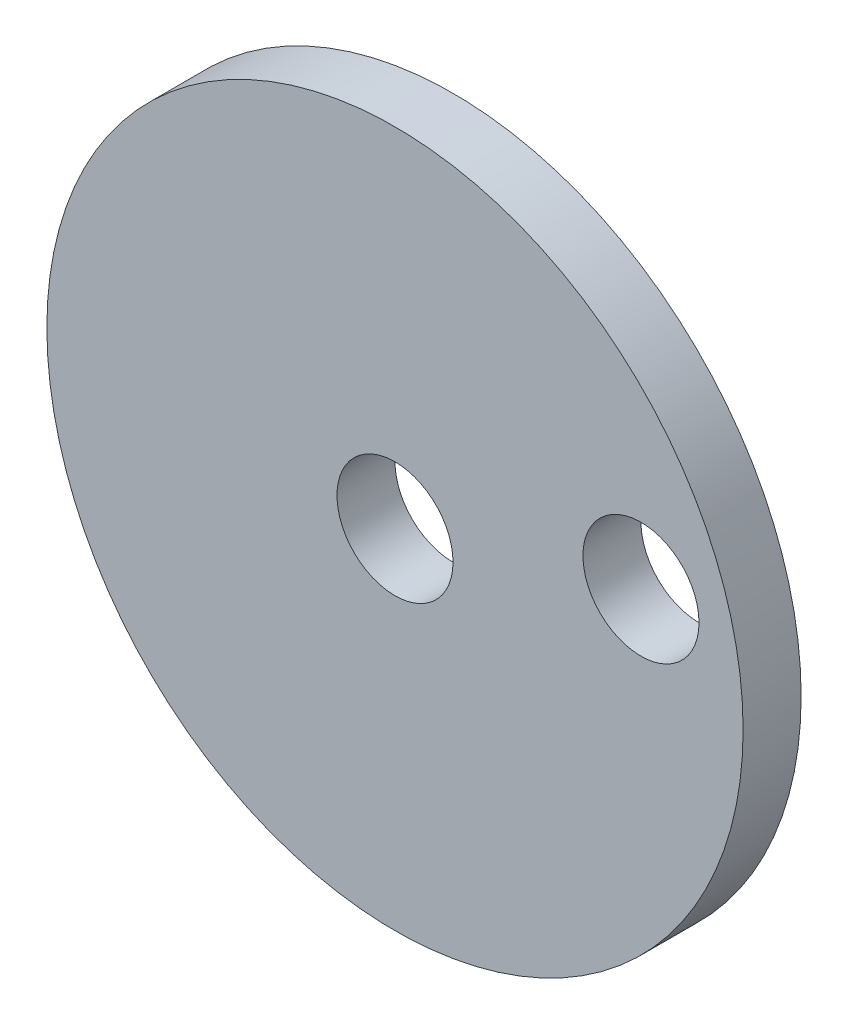
ISO-10303-21;
HEADER;
FILE_DESCRIPTION(('STEP AP214'),'2;1');
FILE_NAME('part.step','',(''),(''),'','','');
FILE_SCHEMA(('AUTOMOTIVE_DESIGN { 1 0 10303 214 1 1 1 1 }'));
ENDSEC;
DATA;
#1=APPLICATION_CONTEXT('core data for automotive mechanical design processes');
#2=APPLICATION_PROTOCOL_DEFINITION('international standard','automotive_design',2000,#1);
#3=PRODUCT_CONTEXT('',#1,'mechanical');
#4=PRODUCT('Part','Part','',(#3));
#5=PRODUCT_RELATED_PRODUCT_CATEGORY('part','',(#4));
#6=PRODUCT_DEFINITION_FORMATION('','',#4);
#7=PRODUCT_DEFINITION_CONTEXT('part definition',#1,'design');
#8=PRODUCT_DEFINITION('design','',#6,#7);
#9=PRODUCT_DEFINITION_SHAPE('','',#8);
#10=(LENGTH_UNIT() NAMED_UNIT(*) SI_UNIT(.MILLI.,.METRE.));
#11=(NAMED_UNIT(*) PLANE_ANGLE_UNIT() SI_UNIT($,.RADIAN.));
#12=(NAMED_UNIT(*) SI_UNIT($,.STERADIAN.) SOLID_ANGLE_UNIT());
#13=UNCERTAINTY_MEASURE_WITH_UNIT(LENGTH_MEASURE(1.E-05),#10,'distance_accuracy_value','');
#14=(GEOMETRIC_REPRESENTATION_CONTEXT(3) GLOBAL_UNCERTAINTY_ASSIGNED_CONTEXT((#13)) GLOBAL_UNIT_ASSIGNED_CONTEXT((#10,
#11,#12)) REPRESENTATION_CONTEXT('',''));
#15=CARTESIAN_POINT('',(0.,0.,0.));
#16=DIRECTION('',(0.,0.,1.));
#17=DIRECTION('',(1.,0.,0.));
#18=AXIS2_PLACEMENT_3D('',#15,#16,#17);
#19=CARTESIAN_POINT('',(0.,0.,6.35));
#20=DIRECTION('',(0.,0.,1.));
#21=DIRECTION('',(1.,0.,0.));
#22=AXIS2_PLACEMENT_3D('',#19,#20,#21);
#23=PLANE('',#22);
#24=CARTESIAN_POINT('',(0.,0.,6.35));
#25=DIRECTION('',(0.,0.,1.));
#26=DIRECTION('',(1.,0.,0.));
#27=AXIS2_PLACEMENT_3D('',#24,#25,#26);
#28=CIRCLE('',#27,6.35);
#29=CARTESIAN_POINT('',(6.35,0.,6.35));
#30=VERTEX_POINT('',#29);
#31=EDGE_CURVE('E54',#30,#30,#28,.T.);
#32=ORIENTED_EDGE('',*,*,#31,.F.);
#33=EDGE_LOOP('',(#32));
#34=FACE_BOUND('',#33,.T.);
#35=CARTESIAN_POINT('',(0.,0.,6.35));
#36=DIRECTION('',(0.,0.,1.));
#37=DIRECTION('',(1.,0.,0.));
#38=AXIS2_PLACEMENT_3D('',#35,#36,#37);
#39=CIRCLE('',#38,38.1);
#40=CARTESIAN_POINT('',(38.1,0.,6.35));
#41=VERTEX_POINT('',#40);
#42=EDGE_CURVE('E10',#41,#41,#39,.T.);
#43=ORIENTED_EDGE('',*,*,#42,.T.);
#44=EDGE_LOOP('',(#43));
#45=FACE_BOUND('',#44,.T.);
#46=CARTESIAN_POINT('',(26.9215158924205,7.73178484107579,6.35));
#47=DIRECTION('',(0.,0.,1.));
#48=DIRECTION('',(1.,0.,0.));
#49=AXIS2_PLACEMENT_3D('',#46,#47,#48);
#50=CIRCLE('',#49,6.35);
#51=CARTESIAN_POINT('',(33.2715158924205,7.73178484107579,6.35));
#52=VERTEX_POINT('',#51);
#53=EDGE_CURVE('E60',#52,#52,#50,.T.);
#54=ORIENTED_EDGE('',*,*,#53,.F.);
#55=EDGE_LOOP('',(#54));
#56=FACE_BOUND('',#55,.T.);
#57=ADVANCED_FACE('F41',(#34,#45,#56),#23,.T.);
#58=CARTESIAN_POINT('',(0.,0.,0.));
#59=DIRECTION('',(0.,0.,1.));
#60=DIRECTION('',(1.,0.,0.));
#61=AXIS2_PLACEMENT_3D('',#58,#59,#60);
#62=PLANE('',#61);
#63=CARTESIAN_POINT('',(0.,0.,0.));
#64=DIRECTION('',(0.,0.,1.));
#65=DIRECTION('',(1.,0.,0.));
#66=AXIS2_PLACEMENT_3D('',#63,#64,#65);
#67=CIRCLE('',#66,38.1);
#68=CARTESIAN_POINT('',(38.1,0.,0.));
#69=VERTEX_POINT('',#68);
#70=EDGE_CURVE('E45',#69,#69,#67,.T.);
#71=ORIENTED_EDGE('',*,*,#70,.F.);
#72=EDGE_LOOP('',(#71));
#73=FACE_BOUND('',#72,.T.);
#74=CARTESIAN_POINT('',(0.,0.,0.));
#75=DIRECTION('',(0.,0.,1.));
#76=DIRECTION('',(1.,0.,0.));
#77=AXIS2_PLACEMENT_3D('',#74,#75,#76);
#78=CIRCLE('',#77,6.35);
#79=CARTESIAN_POINT('',(6.35,0.,0.));
#80=VERTEX_POINT('',#79);
#81=EDGE_CURVE('E56',#80,#80,#78,.T.);
#82=ORIENTED_EDGE('',*,*,#81,.T.);
#83=EDGE_LOOP('',(#82));
#84=FACE_BOUND('',#83,.T.);
#85=CARTESIAN_POINT('',(26.9215158924205,7.73178484107579,0.));
#86=DIRECTION('',(0.,0.,1.));
#87=DIRECTION('',(1.,0.,0.));
#88=AXIS2_PLACEMENT_3D('',#85,#86,#87);
#89=CIRCLE('',#88,6.35);
#90=CARTESIAN_POINT('',(33.2715158924205,7.73178484107579,0.));
#91=VERTEX_POINT('',#90);
#92=EDGE_CURVE('E64',#91,#91,#89,.T.);
#93=ORIENTED_EDGE('',*,*,#92,.T.);
#94=EDGE_LOOP('',(#93));
#95=FACE_BOUND('',#94,.T.);
#96=ADVANCED_FACE('F76',(#73,#84,#95),#62,.F.);
#97=CARTESIAN_POINT('',(0.,0.,6.35));
#98=DIRECTION('',(0.,0.,-1.));
#99=DIRECTION('',(-1.,0.,0.));
#100=AXIS2_PLACEMENT_3D('',#97,#98,#99);
#101=CYLINDRICAL_SURFACE('',#100,38.1);
#102=ORIENTED_EDGE('',*,*,#42,.F.);
#103=EDGE_LOOP('',(#102));
#104=FACE_BOUND('',#103,.T.);
#105=ORIENTED_EDGE('',*,*,#70,.T.);
#106=EDGE_LOOP('',(#105));
#107=FACE_BOUND('',#106,.T.);
#108=ADVANCED_FACE('F43',(#104,#107),#101,.T.);
#109=CARTESIAN_POINT('',(0.,0.,6.35));
#110=DIRECTION('',(0.,0.,-1.));
#111=DIRECTION('',(-1.,0.,0.));
#112=AXIS2_PLACEMENT_3D('',#109,#110,#111);
#113=CYLINDRICAL_SURFACE('',#112,6.35);
#114=ORIENTED_EDGE('',*,*,#31,.T.);
#115=EDGE_LOOP('',(#114));
#116=FACE_BOUND('',#115,.T.);
#117=ORIENTED_EDGE('',*,*,#81,.F.);
#118=EDGE_LOOP('',(#117));
#119=FACE_BOUND('',#118,.T.);
#120=ADVANCED_FACE('F85',(#116,#119),#113,.F.);
#121=CARTESIAN_POINT('',(26.9215158924205,7.73178484107579,6.35));
#122=DIRECTION('',(0.,0.,-1.));
#123=DIRECTION('',(-1.,0.,0.));
#124=AXIS2_PLACEMENT_3D('',#121,#122,#123);
#125=CYLINDRICAL_SURFACE('',#124,6.35);
#126=ORIENTED_EDGE('',*,*,#53,.T.);
#127=EDGE_LOOP('',(#126));
#128=FACE_BOUND('',#127,.T.);
#129=ORIENTED_EDGE('',*,*,#92,.F.);
#130=EDGE_LOOP('',(#129));
#131=FACE_BOUND('',#130,.T.);
#132=ADVANCED_FACE('F72',(#128,#131),#125,.F.);
#133=CLOSED_SHELL('',(#57,#96,#108,#120,#132));
#134=MANIFOLD_SOLID_BREP('B2',#133);
#135=ADVANCED_BREP_SHAPE_REPRESENTATION('',(#18,#134),#14);
#136=SHAPE_DEFINITION_REPRESENTATION(#9,#135);
ENDSEC;
END-ISO-10303-21;
